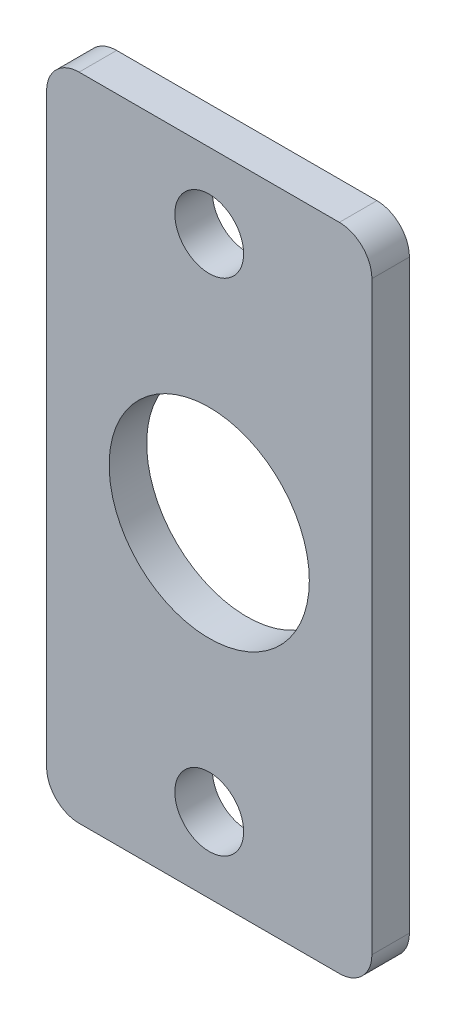
ISO-10303-21;
HEADER;
FILE_DESCRIPTION(('STEP AP214'),'2;1');
FILE_NAME('part.step','',(''),(''),'','','');
FILE_SCHEMA(('AUTOMOTIVE_DESIGN { 1 0 10303 214 1 1 1 1 }'));
ENDSEC;
DATA;
#1=APPLICATION_CONTEXT('core data for automotive mechanical design processes');
#2=APPLICATION_PROTOCOL_DEFINITION('international standard','automotive_design',2000,#1);
#3=PRODUCT_CONTEXT('',#1,'mechanical');
#4=PRODUCT('Part','Part','',(#3));
#5=PRODUCT_RELATED_PRODUCT_CATEGORY('part','',(#4));
#6=PRODUCT_DEFINITION_FORMATION('','',#4);
#7=PRODUCT_DEFINITION_CONTEXT('part definition',#1,'design');
#8=PRODUCT_DEFINITION('design','',#6,#7);
#9=PRODUCT_DEFINITION_SHAPE('','',#8);
#10=(LENGTH_UNIT() NAMED_UNIT(*) SI_UNIT(.MILLI.,.METRE.));
#11=(NAMED_UNIT(*) PLANE_ANGLE_UNIT() SI_UNIT($,.RADIAN.));
#12=(NAMED_UNIT(*) SI_UNIT($,.STERADIAN.) SOLID_ANGLE_UNIT());
#13=UNCERTAINTY_MEASURE_WITH_UNIT(LENGTH_MEASURE(1.E-05),#10,'distance_accuracy_value','');
#14=(GEOMETRIC_REPRESENTATION_CONTEXT(3) GLOBAL_UNCERTAINTY_ASSIGNED_CONTEXT((#13)) GLOBAL_UNIT_ASSIGNED_CONTEXT((#10,
#11,#12)) REPRESENTATION_CONTEXT('',''));
#15=CARTESIAN_POINT('',(0.,0.,0.));
#16=DIRECTION('',(0.,0.,1.));
#17=DIRECTION('',(1.,0.,0.));
#18=AXIS2_PLACEMENT_3D('',#15,#16,#17);
#19=CARTESIAN_POINT('',(-13.,-26.,3.));
#20=DIRECTION('',(0.,1.,0.));
#21=DIRECTION('',(0.,0.,1.));
#22=AXIS2_PLACEMENT_3D('',#19,#20,#21);
#23=PLANE('',#22);
#24=DIRECTION('',(1.,0.,0.));
#25=VECTOR('',#24,1.);
#26=CARTESIAN_POINT('',(-13.,-26.,0.));
#27=LINE('',#26,#25);
#28=CARTESIAN_POINT('',(-10.4,-26.,0.));
#29=VERTEX_POINT('',#28);
#30=CARTESIAN_POINT('',(10.4,-26.,0.));
#31=VERTEX_POINT('',#30);
#32=EDGE_CURVE('E123',#29,#31,#27,.T.);
#33=ORIENTED_EDGE('',*,*,#32,.T.);
#34=DIRECTION('',(0.,0.,-1.));
#35=VECTOR('',#34,1.);
#36=CARTESIAN_POINT('',(10.4,-26.,3.));
#37=LINE('',#36,#35);
#38=CARTESIAN_POINT('',(10.4,-26.,3.));
#39=VERTEX_POINT('',#38);
#40=EDGE_CURVE('E101',#31,#39,#37,.F.);
#41=ORIENTED_EDGE('',*,*,#40,.T.);
#42=DIRECTION('',(1.,0.,0.));
#43=VECTOR('',#42,1.);
#44=CARTESIAN_POINT('',(-13.,-26.,3.));
#45=LINE('',#44,#43);
#46=CARTESIAN_POINT('',(-10.4,-26.,3.));
#47=VERTEX_POINT('',#46);
#48=EDGE_CURVE('E133',#47,#39,#45,.T.);
#49=ORIENTED_EDGE('',*,*,#48,.F.);
#50=DIRECTION('',(0.,0.,-1.));
#51=VECTOR('',#50,1.);
#52=CARTESIAN_POINT('',(-10.4,-26.,3.));
#53=LINE('',#52,#51);
#54=EDGE_CURVE('E106',#47,#29,#53,.T.);
#55=ORIENTED_EDGE('',*,*,#54,.T.);
#56=EDGE_LOOP('',(#33,#41,#49,#55));
#57=FACE_BOUND('',#56,.T.);
#58=ADVANCED_FACE('F30',(#57),#23,.F.);
#59=CARTESIAN_POINT('',(13.,-26.,3.));
#60=DIRECTION('',(-1.,0.,0.));
#61=DIRECTION('',(0.,0.,1.));
#62=AXIS2_PLACEMENT_3D('',#59,#60,#61);
#63=PLANE('',#62);
#64=DIRECTION('',(0.,1.,0.));
#65=VECTOR('',#64,1.);
#66=CARTESIAN_POINT('',(13.,-26.,3.));
#67=LINE('',#66,#65);
#68=CARTESIAN_POINT('',(13.,-23.4,3.));
#69=VERTEX_POINT('',#68);
#70=CARTESIAN_POINT('',(13.,23.4,3.));
#71=VERTEX_POINT('',#70);
#72=EDGE_CURVE('E116',#69,#71,#67,.T.);
#73=ORIENTED_EDGE('',*,*,#72,.F.);
#74=DIRECTION('',(0.,0.,-1.));
#75=VECTOR('',#74,1.);
#76=CARTESIAN_POINT('',(13.,-23.4,3.));
#77=LINE('',#76,#75);
#78=CARTESIAN_POINT('',(13.,-23.4,0.));
#79=VERTEX_POINT('',#78);
#80=EDGE_CURVE('E100',#69,#79,#77,.T.);
#81=ORIENTED_EDGE('',*,*,#80,.T.);
#82=DIRECTION('',(0.,1.,0.));
#83=VECTOR('',#82,1.);
#84=CARTESIAN_POINT('',(13.,-26.,0.));
#85=LINE('',#84,#83);
#86=CARTESIAN_POINT('',(13.,23.4,0.));
#87=VERTEX_POINT('',#86);
#88=EDGE_CURVE('E113',#79,#87,#85,.T.);
#89=ORIENTED_EDGE('',*,*,#88,.T.);
#90=DIRECTION('',(0.,0.,-1.));
#91=VECTOR('',#90,1.);
#92=CARTESIAN_POINT('',(13.,23.4,3.));
#93=LINE('',#92,#91);
#94=EDGE_CURVE('E118',#87,#71,#93,.F.);
#95=ORIENTED_EDGE('',*,*,#94,.T.);
#96=EDGE_LOOP('',(#73,#81,#89,#95));
#97=FACE_BOUND('',#96,.T.);
#98=ADVANCED_FACE('F112',(#97),#63,.F.);
#99=CARTESIAN_POINT('',(-13.,26.,3.));
#100=DIRECTION('',(0.,-1.,0.));
#101=DIRECTION('',(0.,0.,-1.));
#102=AXIS2_PLACEMENT_3D('',#99,#100,#101);
#103=PLANE('',#102);
#104=DIRECTION('',(-1.,0.,0.));
#105=VECTOR('',#104,1.);
#106=CARTESIAN_POINT('',(-13.,26.,0.));
#107=LINE('',#106,#105);
#108=CARTESIAN_POINT('',(10.4,26.,0.));
#109=VERTEX_POINT('',#108);
#110=CARTESIAN_POINT('',(-10.4,26.,0.));
#111=VERTEX_POINT('',#110);
#112=EDGE_CURVE('E122',#109,#111,#107,.T.);
#113=ORIENTED_EDGE('',*,*,#112,.T.);
#114=DIRECTION('',(0.,0.,-1.));
#115=VECTOR('',#114,1.);
#116=CARTESIAN_POINT('',(-10.4,26.,3.));
#117=LINE('',#116,#115);
#118=CARTESIAN_POINT('',(-10.4,26.,3.));
#119=VERTEX_POINT('',#118);
#120=EDGE_CURVE('E11',#111,#119,#117,.F.);
#121=ORIENTED_EDGE('',*,*,#120,.T.);
#122=DIRECTION('',(-1.,0.,0.));
#123=VECTOR('',#122,1.);
#124=CARTESIAN_POINT('',(-13.,26.,3.));
#125=LINE('',#124,#123);
#126=CARTESIAN_POINT('',(10.4,26.,3.));
#127=VERTEX_POINT('',#126);
#128=EDGE_CURVE('E159',#127,#119,#125,.T.);
#129=ORIENTED_EDGE('',*,*,#128,.F.);
#130=DIRECTION('',(0.,0.,-1.));
#131=VECTOR('',#130,1.);
#132=CARTESIAN_POINT('',(10.4,26.,3.));
#133=LINE('',#132,#131);
#134=EDGE_CURVE('E38',#127,#109,#133,.T.);
#135=ORIENTED_EDGE('',*,*,#134,.T.);
#136=EDGE_LOOP('',(#113,#121,#129,#135));
#137=FACE_BOUND('',#136,.T.);
#138=ADVANCED_FACE('F157',(#137),#103,.F.);
#139=CARTESIAN_POINT('',(-13.,-26.,3.));
#140=DIRECTION('',(1.,0.,0.));
#141=DIRECTION('',(0.,0.,-1.));
#142=AXIS2_PLACEMENT_3D('',#139,#140,#141);
#143=PLANE('',#142);
#144=DIRECTION('',(0.,-1.,0.));
#145=VECTOR('',#144,1.);
#146=CARTESIAN_POINT('',(-13.,-26.,0.));
#147=LINE('',#146,#145);
#148=CARTESIAN_POINT('',(-13.,23.4,0.));
#149=VERTEX_POINT('',#148);
#150=CARTESIAN_POINT('',(-13.,-23.4,0.));
#151=VERTEX_POINT('',#150);
#152=EDGE_CURVE('E126',#149,#151,#147,.T.);
#153=ORIENTED_EDGE('',*,*,#152,.T.);
#154=DIRECTION('',(0.,0.,-1.));
#155=VECTOR('',#154,1.);
#156=CARTESIAN_POINT('',(-13.,-23.4,3.));
#157=LINE('',#156,#155);
#158=CARTESIAN_POINT('',(-13.,-23.4,3.));
#159=VERTEX_POINT('',#158);
#160=EDGE_CURVE('E45',#151,#159,#157,.F.);
#161=ORIENTED_EDGE('',*,*,#160,.T.);
#162=DIRECTION('',(0.,-1.,0.));
#163=VECTOR('',#162,1.);
#164=CARTESIAN_POINT('',(-13.,-26.,3.));
#165=LINE('',#164,#163);
#166=CARTESIAN_POINT('',(-13.,23.4,3.));
#167=VERTEX_POINT('',#166);
#168=EDGE_CURVE('E134',#167,#159,#165,.T.);
#169=ORIENTED_EDGE('',*,*,#168,.F.);
#170=DIRECTION('',(0.,0.,-1.));
#171=VECTOR('',#170,1.);
#172=CARTESIAN_POINT('',(-13.,23.4,3.));
#173=LINE('',#172,#171);
#174=EDGE_CURVE('E150',#167,#149,#173,.T.);
#175=ORIENTED_EDGE('',*,*,#174,.T.);
#176=EDGE_LOOP('',(#153,#161,#169,#175));
#177=FACE_BOUND('',#176,.T.);
#178=ADVANCED_FACE('F166',(#177),#143,.F.);
#179=CARTESIAN_POINT('',(13.,-26.,3.));
#180=DIRECTION('',(0.,0.,1.));
#181=DIRECTION('',(1.,0.,0.));
#182=AXIS2_PLACEMENT_3D('',#179,#180,#181);
#183=PLANE('',#182);
#184=CARTESIAN_POINT('',(0.,-20.,3.));
#185=DIRECTION('',(0.,0.,1.));
#186=DIRECTION('',(-1.,0.,0.));
#187=AXIS2_PLACEMENT_3D('',#184,#185,#186);
#188=CIRCLE('',#187,2.75);
#189=CARTESIAN_POINT('',(-2.75000000000001,-20.,3.));
#190=VERTEX_POINT('',#189);
#191=EDGE_CURVE('E185',#190,#190,#188,.T.);
#192=ORIENTED_EDGE('',*,*,#191,.F.);
#193=EDGE_LOOP('',(#192));
#194=FACE_BOUND('',#193,.T.);
#195=CARTESIAN_POINT('',(0.,20.,3.));
#196=DIRECTION('',(0.,0.,1.));
#197=DIRECTION('',(1.,0.,0.));
#198=AXIS2_PLACEMENT_3D('',#195,#196,#197);
#199=CIRCLE('',#198,2.75);
#200=CARTESIAN_POINT('',(2.75,20.,3.));
#201=VERTEX_POINT('',#200);
#202=EDGE_CURVE('E179',#201,#201,#199,.T.);
#203=ORIENTED_EDGE('',*,*,#202,.F.);
#204=EDGE_LOOP('',(#203));
#205=FACE_BOUND('',#204,.T.);
#206=CARTESIAN_POINT('',(0.,0.,3.));
#207=DIRECTION('',(0.,0.,1.));
#208=DIRECTION('',(1.,0.,0.));
#209=AXIS2_PLACEMENT_3D('',#206,#207,#208);
#210=CIRCLE('',#209,8.);
#211=CARTESIAN_POINT('',(8.,0.,3.));
#212=VERTEX_POINT('',#211);
#213=EDGE_CURVE('E173',#212,#212,#210,.T.);
#214=ORIENTED_EDGE('',*,*,#213,.F.);
#215=EDGE_LOOP('',(#214));
#216=FACE_BOUND('',#215,.T.);
#217=ORIENTED_EDGE('',*,*,#48,.T.);
#218=CARTESIAN_POINT('',(10.4,-23.4,3.));
#219=DIRECTION('',(0.,0.,1.));
#220=DIRECTION('',(1.,0.,0.));
#221=AXIS2_PLACEMENT_3D('',#218,#219,#220);
#222=CIRCLE('',#221,2.6);
#223=EDGE_CURVE('E148',#39,#69,#222,.T.);
#224=ORIENTED_EDGE('',*,*,#223,.T.);
#225=ORIENTED_EDGE('',*,*,#72,.T.);
#226=CARTESIAN_POINT('',(10.4,23.4,3.));
#227=DIRECTION('',(0.,0.,1.));
#228=DIRECTION('',(1.,0.,0.));
#229=AXIS2_PLACEMENT_3D('',#226,#227,#228);
#230=CIRCLE('',#229,2.6);
#231=EDGE_CURVE('E143',#71,#127,#230,.T.);
#232=ORIENTED_EDGE('',*,*,#231,.T.);
#233=ORIENTED_EDGE('',*,*,#128,.T.);
#234=CARTESIAN_POINT('',(-10.4,23.4,3.));
#235=DIRECTION('',(0.,0.,1.));
#236=DIRECTION('',(1.,0.,0.));
#237=AXIS2_PLACEMENT_3D('',#234,#235,#236);
#238=CIRCLE('',#237,2.6);
#239=EDGE_CURVE('E52',#119,#167,#238,.T.);
#240=ORIENTED_EDGE('',*,*,#239,.T.);
#241=ORIENTED_EDGE('',*,*,#168,.T.);
#242=CARTESIAN_POINT('',(-10.4,-23.4,3.));
#243=DIRECTION('',(0.,0.,1.));
#244=DIRECTION('',(1.,0.,0.));
#245=AXIS2_PLACEMENT_3D('',#242,#243,#244);
#246=CIRCLE('',#245,2.6);
#247=EDGE_CURVE('E146',#159,#47,#246,.T.);
#248=ORIENTED_EDGE('',*,*,#247,.T.);
#249=EDGE_LOOP('',(#217,#224,#225,#232,#233,#240,#241,#248));
#250=FACE_BOUND('',#249,.T.);
#251=ADVANCED_FACE('F200',(#194,#205,#216,#250),#183,.T.);
#252=CARTESIAN_POINT('',(13.,-26.,0.));
#253=DIRECTION('',(0.,0.,1.));
#254=DIRECTION('',(1.,0.,0.));
#255=AXIS2_PLACEMENT_3D('',#252,#253,#254);
#256=PLANE('',#255);
#257=CARTESIAN_POINT('',(0.,-20.,0.));
#258=DIRECTION('',(0.,0.,1.));
#259=DIRECTION('',(-1.,0.,0.));
#260=AXIS2_PLACEMENT_3D('',#257,#258,#259);
#261=CIRCLE('',#260,2.75);
#262=CARTESIAN_POINT('',(-2.75000000000001,-20.,0.));
#263=VERTEX_POINT('',#262);
#264=EDGE_CURVE('E182',#263,#263,#261,.T.);
#265=ORIENTED_EDGE('',*,*,#264,.T.);
#266=EDGE_LOOP('',(#265));
#267=FACE_BOUND('',#266,.T.);
#268=CARTESIAN_POINT('',(0.,20.,0.));
#269=DIRECTION('',(0.,0.,1.));
#270=DIRECTION('',(1.,0.,0.));
#271=AXIS2_PLACEMENT_3D('',#268,#269,#270);
#272=CIRCLE('',#271,2.75);
#273=CARTESIAN_POINT('',(2.75,20.,0.));
#274=VERTEX_POINT('',#273);
#275=EDGE_CURVE('E176',#274,#274,#272,.T.);
#276=ORIENTED_EDGE('',*,*,#275,.T.);
#277=EDGE_LOOP('',(#276));
#278=FACE_BOUND('',#277,.T.);
#279=CARTESIAN_POINT('',(0.,0.,0.));
#280=DIRECTION('',(0.,0.,1.));
#281=DIRECTION('',(1.,0.,0.));
#282=AXIS2_PLACEMENT_3D('',#279,#280,#281);
#283=CIRCLE('',#282,8.);
#284=CARTESIAN_POINT('',(8.,0.,0.));
#285=VERTEX_POINT('',#284);
#286=EDGE_CURVE('E128',#285,#285,#283,.T.);
#287=ORIENTED_EDGE('',*,*,#286,.T.);
#288=EDGE_LOOP('',(#287));
#289=FACE_BOUND('',#288,.T.);
#290=ORIENTED_EDGE('',*,*,#88,.F.);
#291=CARTESIAN_POINT('',(10.4,-23.4,0.));
#292=DIRECTION('',(0.,0.,1.));
#293=DIRECTION('',(1.,0.,0.));
#294=AXIS2_PLACEMENT_3D('',#291,#292,#293);
#295=CIRCLE('',#294,2.6);
#296=EDGE_CURVE('E96',#79,#31,#295,.F.);
#297=ORIENTED_EDGE('',*,*,#296,.T.);
#298=ORIENTED_EDGE('',*,*,#32,.F.);
#299=CARTESIAN_POINT('',(-10.4,-23.4,0.));
#300=DIRECTION('',(0.,0.,1.));
#301=DIRECTION('',(1.,0.,0.));
#302=AXIS2_PLACEMENT_3D('',#299,#300,#301);
#303=CIRCLE('',#302,2.6);
#304=EDGE_CURVE('E107',#29,#151,#303,.F.);
#305=ORIENTED_EDGE('',*,*,#304,.T.);
#306=ORIENTED_EDGE('',*,*,#152,.F.);
#307=CARTESIAN_POINT('',(-10.4,23.4,0.));
#308=DIRECTION('',(0.,0.,1.));
#309=DIRECTION('',(1.,0.,0.));
#310=AXIS2_PLACEMENT_3D('',#307,#308,#309);
#311=CIRCLE('',#310,2.6);
#312=EDGE_CURVE('E137',#149,#111,#311,.F.);
#313=ORIENTED_EDGE('',*,*,#312,.T.);
#314=ORIENTED_EDGE('',*,*,#112,.F.);
#315=CARTESIAN_POINT('',(10.4,23.4,0.));
#316=DIRECTION('',(0.,0.,1.));
#317=DIRECTION('',(1.,0.,0.));
#318=AXIS2_PLACEMENT_3D('',#315,#316,#317);
#319=CIRCLE('',#318,2.6);
#320=EDGE_CURVE('E117',#109,#87,#319,.F.);
#321=ORIENTED_EDGE('',*,*,#320,.T.);
#322=EDGE_LOOP('',(#290,#297,#298,#305,#306,#313,#314,#321));
#323=FACE_BOUND('',#322,.T.);
#324=ADVANCED_FACE('F120',(#267,#278,#289,#323),#256,.F.);
#325=CARTESIAN_POINT('',(0.,0.,0.));
#326=DIRECTION('',(0.,0.,1.));
#327=DIRECTION('',(1.,0.,0.));
#328=AXIS2_PLACEMENT_3D('',#325,#326,#327);
#329=CYLINDRICAL_SURFACE('',#328,8.);
#330=ORIENTED_EDGE('',*,*,#286,.F.);
#331=EDGE_LOOP('',(#330));
#332=FACE_BOUND('',#331,.T.);
#333=ORIENTED_EDGE('',*,*,#213,.T.);
#334=EDGE_LOOP('',(#333));
#335=FACE_BOUND('',#334,.T.);
#336=ADVANCED_FACE('F218',(#332,#335),#329,.F.);
#337=CARTESIAN_POINT('',(10.4,-23.4,3.));
#338=DIRECTION('',(0.,0.,-1.));
#339=DIRECTION('',(-1.,0.,0.));
#340=AXIS2_PLACEMENT_3D('',#337,#338,#339);
#341=CYLINDRICAL_SURFACE('',#340,2.6);
#342=ORIENTED_EDGE('',*,*,#223,.F.);
#343=ORIENTED_EDGE('',*,*,#40,.F.);
#344=ORIENTED_EDGE('',*,*,#296,.F.);
#345=ORIENTED_EDGE('',*,*,#80,.F.);
#346=EDGE_LOOP('',(#342,#343,#344,#345));
#347=FACE_BOUND('',#346,.T.);
#348=ADVANCED_FACE('F99',(#347),#341,.T.);
#349=CARTESIAN_POINT('',(-10.4,-23.4,3.));
#350=DIRECTION('',(0.,0.,-1.));
#351=DIRECTION('',(-1.,0.,0.));
#352=AXIS2_PLACEMENT_3D('',#349,#350,#351);
#353=CYLINDRICAL_SURFACE('',#352,2.6);
#354=ORIENTED_EDGE('',*,*,#247,.F.);
#355=ORIENTED_EDGE('',*,*,#160,.F.);
#356=ORIENTED_EDGE('',*,*,#304,.F.);
#357=ORIENTED_EDGE('',*,*,#54,.F.);
#358=EDGE_LOOP('',(#354,#355,#356,#357));
#359=FACE_BOUND('',#358,.T.);
#360=ADVANCED_FACE('F211',(#359),#353,.T.);
#361=CARTESIAN_POINT('',(-10.4,23.4,3.));
#362=DIRECTION('',(0.,0.,-1.));
#363=DIRECTION('',(-1.,0.,0.));
#364=AXIS2_PLACEMENT_3D('',#361,#362,#363);
#365=CYLINDRICAL_SURFACE('',#364,2.6);
#366=ORIENTED_EDGE('',*,*,#239,.F.);
#367=ORIENTED_EDGE('',*,*,#120,.F.);
#368=ORIENTED_EDGE('',*,*,#312,.F.);
#369=ORIENTED_EDGE('',*,*,#174,.F.);
#370=EDGE_LOOP('',(#366,#367,#368,#369));
#371=FACE_BOUND('',#370,.T.);
#372=ADVANCED_FACE('F165',(#371),#365,.T.);
#373=CARTESIAN_POINT('',(10.4,23.4,3.));
#374=DIRECTION('',(0.,0.,-1.));
#375=DIRECTION('',(-1.,0.,0.));
#376=AXIS2_PLACEMENT_3D('',#373,#374,#375);
#377=CYLINDRICAL_SURFACE('',#376,2.6);
#378=ORIENTED_EDGE('',*,*,#231,.F.);
#379=ORIENTED_EDGE('',*,*,#94,.F.);
#380=ORIENTED_EDGE('',*,*,#320,.F.);
#381=ORIENTED_EDGE('',*,*,#134,.F.);
#382=EDGE_LOOP('',(#378,#379,#380,#381));
#383=FACE_BOUND('',#382,.T.);
#384=ADVANCED_FACE('F32',(#383),#377,.T.);
#385=CARTESIAN_POINT('',(0.,20.,0.));
#386=DIRECTION('',(0.,0.,1.));
#387=DIRECTION('',(1.,0.,0.));
#388=AXIS2_PLACEMENT_3D('',#385,#386,#387);
#389=CYLINDRICAL_SURFACE('',#388,2.75);
#390=ORIENTED_EDGE('',*,*,#275,.F.);
#391=EDGE_LOOP('',(#390));
#392=FACE_BOUND('',#391,.T.);
#393=ORIENTED_EDGE('',*,*,#202,.T.);
#394=EDGE_LOOP('',(#393));
#395=FACE_BOUND('',#394,.T.);
#396=ADVANCED_FACE('F196',(#392,#395),#389,.F.);
#397=CARTESIAN_POINT('',(0.,-20.,0.));
#398=DIRECTION('',(0.,0.,1.));
#399=DIRECTION('',(1.,0.,0.));
#400=AXIS2_PLACEMENT_3D('',#397,#398,#399);
#401=CYLINDRICAL_SURFACE('',#400,2.75);
#402=ORIENTED_EDGE('',*,*,#264,.F.);
#403=EDGE_LOOP('',(#402));
#404=FACE_BOUND('',#403,.T.);
#405=ORIENTED_EDGE('',*,*,#191,.T.);
#406=EDGE_LOOP('',(#405));
#407=FACE_BOUND('',#406,.T.);
#408=ADVANCED_FACE('F193',(#404,#407),#401,.F.);
#409=CLOSED_SHELL('',(#58,#98,#138,#178,#251,#324,#336,#348,#360,#372,#384,#396,#408));
#410=MANIFOLD_SOLID_BREP('B2',#409);
#411=ADVANCED_BREP_SHAPE_REPRESENTATION('',(#18,#410),#14);
#412=SHAPE_DEFINITION_REPRESENTATION(#9,#411);
ENDSEC;
END-ISO-10303-21;
